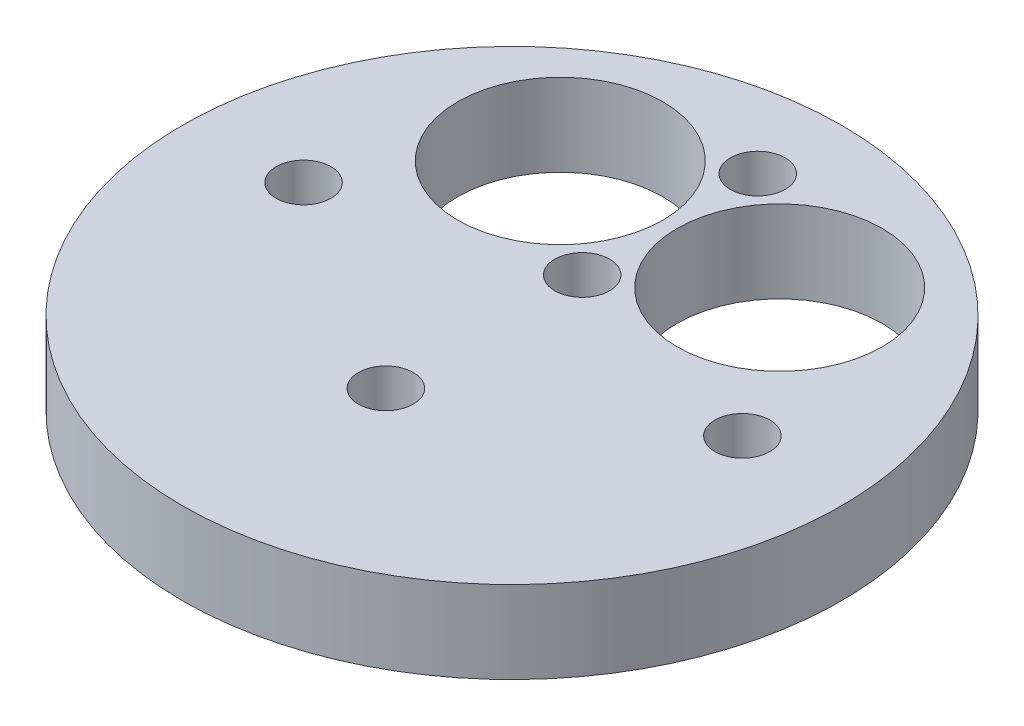
ISO-10303-21;
HEADER;
FILE_DESCRIPTION(('STEP AP214'),'2;1');
FILE_NAME('part.step','',(''),(''),'','','');
FILE_SCHEMA(('AUTOMOTIVE_DESIGN { 1 0 10303 214 1 1 1 1 }'));
ENDSEC;
DATA;
#1=APPLICATION_CONTEXT('core data for automotive mechanical design processes');
#2=APPLICATION_PROTOCOL_DEFINITION('international standard','automotive_design',2000,#1);
#3=PRODUCT_CONTEXT('',#1,'mechanical');
#4=PRODUCT('Part','Part','',(#3));
#5=PRODUCT_RELATED_PRODUCT_CATEGORY('part','',(#4));
#6=PRODUCT_DEFINITION_FORMATION('','',#4);
#7=PRODUCT_DEFINITION_CONTEXT('part definition',#1,'design');
#8=PRODUCT_DEFINITION('design','',#6,#7);
#9=PRODUCT_DEFINITION_SHAPE('','',#8);
#10=(LENGTH_UNIT() NAMED_UNIT(*) SI_UNIT(.MILLI.,.METRE.));
#11=(NAMED_UNIT(*) PLANE_ANGLE_UNIT() SI_UNIT($,.RADIAN.));
#12=(NAMED_UNIT(*) SI_UNIT($,.STERADIAN.) SOLID_ANGLE_UNIT());
#13=UNCERTAINTY_MEASURE_WITH_UNIT(LENGTH_MEASURE(1.E-05),#10,'distance_accuracy_value','');
#14=(GEOMETRIC_REPRESENTATION_CONTEXT(3) GLOBAL_UNCERTAINTY_ASSIGNED_CONTEXT((#13)) GLOBAL_UNIT_ASSIGNED_CONTEXT((#10,
#11,#12)) REPRESENTATION_CONTEXT('',''));
#15=CARTESIAN_POINT('',(0.,0.,0.));
#16=DIRECTION('',(0.,0.,1.));
#17=DIRECTION('',(1.,0.,0.));
#18=AXIS2_PLACEMENT_3D('',#15,#16,#17);
#19=CARTESIAN_POINT('',(0.,0.,0.));
#20=DIRECTION('',(0.,-1.,0.));
#21=DIRECTION('',(0.,0.,-1.));
#22=AXIS2_PLACEMENT_3D('',#19,#20,#21);
#23=PLANE('',#22);
#24=CARTESIAN_POINT('',(-25.4,0.,-1.27));
#25=DIRECTION('',(0.,1.,0.));
#26=DIRECTION('',(0.,0.,1.));
#27=AXIS2_PLACEMENT_3D('',#24,#25,#26);
#28=CIRCLE('',#27,3.175);
#29=CARTESIAN_POINT('',(-25.4,0.,1.905));
#30=VERTEX_POINT('',#29);
#31=EDGE_CURVE('E121',#30,#30,#28,.T.);
#32=ORIENTED_EDGE('',*,*,#31,.T.);
#33=EDGE_LOOP('',(#32));
#34=FACE_BOUND('',#33,.T.);
#35=CARTESIAN_POINT('',(25.4,0.,-1.27000000000001));
#36=DIRECTION('',(0.,1.,0.));
#37=DIRECTION('',(0.,0.,1.));
#38=AXIS2_PLACEMENT_3D('',#35,#36,#37);
#39=CIRCLE('',#38,3.175);
#40=CARTESIAN_POINT('',(25.4,0.,1.90499999999999));
#41=VERTEX_POINT('',#40);
#42=EDGE_CURVE('E125',#41,#41,#39,.T.);
#43=ORIENTED_EDGE('',*,*,#42,.T.);
#44=EDGE_LOOP('',(#43));
#45=FACE_BOUND('',#44,.T.);
#46=CARTESIAN_POINT('',(0.,0.,-28.448));
#47=DIRECTION('',(0.,1.,0.));
#48=DIRECTION('',(0.,0.,1.));
#49=AXIS2_PLACEMENT_3D('',#46,#47,#48);
#50=CIRCLE('',#49,3.175);
#51=CARTESIAN_POINT('',(0.,0.,-25.273));
#52=VERTEX_POINT('',#51);
#53=EDGE_CURVE('E138',#52,#52,#50,.T.);
#54=ORIENTED_EDGE('',*,*,#53,.T.);
#55=EDGE_LOOP('',(#54));
#56=FACE_BOUND('',#55,.T.);
#57=CARTESIAN_POINT('',(12.7,0.,-18.288));
#58=DIRECTION('',(0.,1.,0.));
#59=DIRECTION('',(0.,0.,1.));
#60=AXIS2_PLACEMENT_3D('',#57,#58,#59);
#61=CIRCLE('',#60,11.8745);
#62=CARTESIAN_POINT('',(12.7,0.,-6.4135));
#63=VERTEX_POINT('',#62);
#64=EDGE_CURVE('E143',#63,#63,#61,.T.);
#65=ORIENTED_EDGE('',*,*,#64,.T.);
#66=EDGE_LOOP('',(#65));
#67=FACE_BOUND('',#66,.T.);
#68=CARTESIAN_POINT('',(0.,0.,-8.128));
#69=DIRECTION('',(0.,1.,0.));
#70=DIRECTION('',(0.,0.,1.));
#71=AXIS2_PLACEMENT_3D('',#68,#69,#70);
#72=CIRCLE('',#71,3.175);
#73=CARTESIAN_POINT('',(0.,0.,-4.953));
#74=VERTEX_POINT('',#73);
#75=EDGE_CURVE('E135',#74,#74,#72,.T.);
#76=ORIENTED_EDGE('',*,*,#75,.T.);
#77=EDGE_LOOP('',(#76));
#78=FACE_BOUND('',#77,.T.);
#79=CARTESIAN_POINT('',(0.,0.,14.605));
#80=DIRECTION('',(0.,1.,0.));
#81=DIRECTION('',(0.,0.,1.));
#82=AXIS2_PLACEMENT_3D('',#79,#80,#81);
#83=CIRCLE('',#82,3.175);
#84=CARTESIAN_POINT('',(0.,0.,17.78));
#85=VERTEX_POINT('',#84);
#86=EDGE_CURVE('E127',#85,#85,#83,.T.);
#87=ORIENTED_EDGE('',*,*,#86,.T.);
#88=EDGE_LOOP('',(#87));
#89=FACE_BOUND('',#88,.T.);
#90=CARTESIAN_POINT('',(-12.7,0.,-18.288));
#91=DIRECTION('',(0.,1.,0.));
#92=DIRECTION('',(0.,0.,1.));
#93=AXIS2_PLACEMENT_3D('',#90,#91,#92);
#94=CIRCLE('',#93,11.8745);
#95=CARTESIAN_POINT('',(-12.7,0.,-6.4135));
#96=VERTEX_POINT('',#95);
#97=EDGE_CURVE('E55',#96,#96,#94,.T.);
#98=ORIENTED_EDGE('',*,*,#97,.T.);
#99=EDGE_LOOP('',(#98));
#100=FACE_BOUND('',#99,.T.);
#101=CARTESIAN_POINT('',(0.,0.,0.));
#102=DIRECTION('',(0.,-1.,0.));
#103=DIRECTION('',(0.,0.,-1.));
#104=AXIS2_PLACEMENT_3D('',#101,#102,#103);
#105=CIRCLE('',#104,38.1508);
#106=CARTESIAN_POINT('',(0.,0.,-38.1508));
#107=VERTEX_POINT('',#106);
#108=EDGE_CURVE('E10',#107,#107,#105,.T.);
#109=ORIENTED_EDGE('',*,*,#108,.T.);
#110=EDGE_LOOP('',(#109));
#111=FACE_BOUND('',#110,.T.);
#112=ADVANCED_FACE('F36',(#34,#45,#56,#67,#78,#89,#100,#111),#23,.T.);
#113=CARTESIAN_POINT('',(0.,0.,0.));
#114=DIRECTION('',(0.,-1.,0.));
#115=DIRECTION('',(0.,0.,-1.));
#116=AXIS2_PLACEMENT_3D('',#113,#114,#115);
#117=CYLINDRICAL_SURFACE('',#116,38.1508);
#118=CARTESIAN_POINT('',(0.,9.525,0.));
#119=DIRECTION('',(0.,-1.,0.));
#120=DIRECTION('',(0.,0.,-1.));
#121=AXIS2_PLACEMENT_3D('',#118,#119,#120);
#122=CIRCLE('',#121,38.1508);
#123=CARTESIAN_POINT('',(0.,9.525,-38.1508));
#124=VERTEX_POINT('',#123);
#125=EDGE_CURVE('E43',#124,#124,#122,.T.);
#126=ORIENTED_EDGE('',*,*,#125,.T.);
#127=EDGE_LOOP('',(#126));
#128=FACE_BOUND('',#127,.T.);
#129=ORIENTED_EDGE('',*,*,#108,.F.);
#130=EDGE_LOOP('',(#129));
#131=FACE_BOUND('',#130,.T.);
#132=ADVANCED_FACE('F74',(#128,#131),#117,.T.);
#133=CARTESIAN_POINT('',(38.1508,9.525,0.));
#134=DIRECTION('',(0.,1.,0.));
#135=DIRECTION('',(0.,0.,1.));
#136=AXIS2_PLACEMENT_3D('',#133,#134,#135);
#137=PLANE('',#136);
#138=CARTESIAN_POINT('',(-25.4,9.525,-1.27));
#139=DIRECTION('',(0.,1.,0.));
#140=DIRECTION('',(0.,0.,1.));
#141=AXIS2_PLACEMENT_3D('',#138,#139,#140);
#142=CIRCLE('',#141,3.175);
#143=CARTESIAN_POINT('',(-25.4,9.52499999999999,1.905));
#144=VERTEX_POINT('',#143);
#145=EDGE_CURVE('E124',#144,#144,#142,.T.);
#146=ORIENTED_EDGE('',*,*,#145,.F.);
#147=EDGE_LOOP('',(#146));
#148=FACE_BOUND('',#147,.T.);
#149=CARTESIAN_POINT('',(25.4,9.525,-1.27000000000001));
#150=DIRECTION('',(0.,1.,0.));
#151=DIRECTION('',(0.,0.,1.));
#152=AXIS2_PLACEMENT_3D('',#149,#150,#151);
#153=CIRCLE('',#152,3.175);
#154=CARTESIAN_POINT('',(25.4,9.52499999999999,1.90499999999999));
#155=VERTEX_POINT('',#154);
#156=EDGE_CURVE('E130',#155,#155,#153,.T.);
#157=ORIENTED_EDGE('',*,*,#156,.F.);
#158=EDGE_LOOP('',(#157));
#159=FACE_BOUND('',#158,.T.);
#160=CARTESIAN_POINT('',(0.,9.525,-28.448));
#161=DIRECTION('',(0.,1.,0.));
#162=DIRECTION('',(0.,0.,1.));
#163=AXIS2_PLACEMENT_3D('',#160,#161,#162);
#164=CIRCLE('',#163,3.175);
#165=CARTESIAN_POINT('',(0.,9.52499999999999,-25.273));
#166=VERTEX_POINT('',#165);
#167=EDGE_CURVE('E39',#166,#166,#164,.T.);
#168=ORIENTED_EDGE('',*,*,#167,.F.);
#169=EDGE_LOOP('',(#168));
#170=FACE_BOUND('',#169,.T.);
#171=CARTESIAN_POINT('',(12.7,9.525,-18.288));
#172=DIRECTION('',(0.,1.,0.));
#173=DIRECTION('',(0.,0.,1.));
#174=AXIS2_PLACEMENT_3D('',#171,#172,#173);
#175=CIRCLE('',#174,11.8745);
#176=CARTESIAN_POINT('',(12.7,9.52499999999999,-6.4135));
#177=VERTEX_POINT('',#176);
#178=EDGE_CURVE('E60',#177,#177,#175,.T.);
#179=ORIENTED_EDGE('',*,*,#178,.F.);
#180=EDGE_LOOP('',(#179));
#181=FACE_BOUND('',#180,.T.);
#182=CARTESIAN_POINT('',(0.,9.525,-8.128));
#183=DIRECTION('',(0.,1.,0.));
#184=DIRECTION('',(0.,0.,1.));
#185=AXIS2_PLACEMENT_3D('',#182,#183,#184);
#186=CIRCLE('',#185,3.175);
#187=CARTESIAN_POINT('',(0.,9.52499999999999,-4.953));
#188=VERTEX_POINT('',#187);
#189=EDGE_CURVE('E58',#188,#188,#186,.T.);
#190=ORIENTED_EDGE('',*,*,#189,.F.);
#191=EDGE_LOOP('',(#190));
#192=FACE_BOUND('',#191,.T.);
#193=CARTESIAN_POINT('',(0.,9.525,14.605));
#194=DIRECTION('',(0.,1.,0.));
#195=DIRECTION('',(0.,0.,1.));
#196=AXIS2_PLACEMENT_3D('',#193,#194,#195);
#197=CIRCLE('',#196,3.175);
#198=CARTESIAN_POINT('',(0.,9.52499999999999,17.78));
#199=VERTEX_POINT('',#198);
#200=EDGE_CURVE('E54',#199,#199,#197,.T.);
#201=ORIENTED_EDGE('',*,*,#200,.F.);
#202=EDGE_LOOP('',(#201));
#203=FACE_BOUND('',#202,.T.);
#204=CARTESIAN_POINT('',(-12.7,9.525,-18.288));
#205=DIRECTION('',(0.,1.,0.));
#206=DIRECTION('',(0.,0.,1.));
#207=AXIS2_PLACEMENT_3D('',#204,#205,#206);
#208=CIRCLE('',#207,11.8745);
#209=CARTESIAN_POINT('',(-12.7,9.52499999999999,-6.4135));
#210=VERTEX_POINT('',#209);
#211=EDGE_CURVE('E51',#210,#210,#208,.T.);
#212=ORIENTED_EDGE('',*,*,#211,.F.);
#213=EDGE_LOOP('',(#212));
#214=FACE_BOUND('',#213,.T.);
#215=ORIENTED_EDGE('',*,*,#125,.F.);
#216=EDGE_LOOP('',(#215));
#217=FACE_BOUND('',#216,.T.);
#218=ADVANCED_FACE('F70',(#148,#159,#170,#181,#192,#203,#214,#217),#137,.T.);
#219=CARTESIAN_POINT('',(-12.7,0.,-18.288));
#220=DIRECTION('',(0.,1.,0.));
#221=DIRECTION('',(0.,0.,1.));
#222=AXIS2_PLACEMENT_3D('',#219,#220,#221);
#223=CYLINDRICAL_SURFACE('',#222,11.8745);
#224=CARTESIAN_POINT('',(-12.7,9.52499999999999,-6.4135));
#225=CARTESIAN_POINT('',(-12.7,9.42578124999999,-6.4135));
#226=CARTESIAN_POINT('',(-12.7,9.32656249999999,-6.4135));
#227=CARTESIAN_POINT('',(-12.7,9.12812499999999,-6.4135));
#228=CARTESIAN_POINT('',(-12.7,9.02890624999999,-6.4135));
#229=CARTESIAN_POINT('',(-12.7,8.83046874999999,-6.4135));
#230=CARTESIAN_POINT('',(-12.7,8.73124999999999,-6.4135));
#231=CARTESIAN_POINT('',(-12.7,8.5328125,-6.4135));
#232=CARTESIAN_POINT('',(-12.7,8.43359374999999,-6.4135));
#233=CARTESIAN_POINT('',(-12.7,8.23515625,-6.4135));
#234=CARTESIAN_POINT('',(-12.7,8.13593749999999,-6.4135));
#235=CARTESIAN_POINT('',(-12.7,7.93749999999999,-6.4135));
#236=CARTESIAN_POINT('',(-12.7,7.83828125,-6.4135));
#237=CARTESIAN_POINT('',(-12.7,7.63984374999999,-6.4135));
#238=CARTESIAN_POINT('',(-12.7,7.540625,-6.4135));
#239=CARTESIAN_POINT('',(-12.7,7.3421875,-6.4135));
#240=CARTESIAN_POINT('',(-12.7,7.24296874999999,-6.4135));
#241=CARTESIAN_POINT('',(-12.7,7.04453125,-6.4135));
#242=CARTESIAN_POINT('',(-12.7,6.9453125,-6.4135));
#243=CARTESIAN_POINT('',(-12.7,6.746875,-6.4135));
#244=CARTESIAN_POINT('',(-12.7,6.64765625,-6.4135));
#245=CARTESIAN_POINT('',(-12.7,6.44921875,-6.4135));
#246=CARTESIAN_POINT('',(-12.7,6.35,-6.4135));
#247=CARTESIAN_POINT('',(-12.7,6.1515625,-6.4135));
#248=CARTESIAN_POINT('',(-12.7,6.05234375,-6.4135));
#249=CARTESIAN_POINT('',(-12.7,5.85390625,-6.4135));
#250=CARTESIAN_POINT('',(-12.7,5.7546875,-6.4135));
#251=CARTESIAN_POINT('',(-12.7,5.55625,-6.4135));
#252=CARTESIAN_POINT('',(-12.7,5.45703125,-6.4135));
#253=CARTESIAN_POINT('',(-12.7,5.25859375,-6.4135));
#254=CARTESIAN_POINT('',(-12.7,5.159375,-6.4135));
#255=CARTESIAN_POINT('',(-12.7,4.9609375,-6.4135));
#256=CARTESIAN_POINT('',(-12.7,4.86171875,-6.4135));
#257=CARTESIAN_POINT('',(-12.7,4.66328125,-6.4135));
#258=CARTESIAN_POINT('',(-12.7,4.5640625,-6.4135));
#259=CARTESIAN_POINT('',(-12.7,4.365625,-6.4135));
#260=CARTESIAN_POINT('',(-12.7,4.26640625,-6.4135));
#261=CARTESIAN_POINT('',(-12.7,4.06796875,-6.4135));
#262=CARTESIAN_POINT('',(-12.7,3.96875,-6.4135));
#263=CARTESIAN_POINT('',(-12.7,3.7703125,-6.4135));
#264=CARTESIAN_POINT('',(-12.7,3.67109375,-6.4135));
#265=CARTESIAN_POINT('',(-12.7,3.47265625,-6.4135));
#266=CARTESIAN_POINT('',(-12.7,3.3734375,-6.4135));
#267=CARTESIAN_POINT('',(-12.7,3.175,-6.4135));
#268=CARTESIAN_POINT('',(-12.7,3.07578125,-6.4135));
#269=CARTESIAN_POINT('',(-12.7,2.87734375,-6.4135));
#270=CARTESIAN_POINT('',(-12.7,2.778125,-6.4135));
#271=CARTESIAN_POINT('',(-12.7,2.5796875,-6.4135));
#272=CARTESIAN_POINT('',(-12.7,2.48046875,-6.4135));
#273=CARTESIAN_POINT('',(-12.7,2.28203125,-6.4135));
#274=CARTESIAN_POINT('',(-12.7,2.1828125,-6.4135));
#275=CARTESIAN_POINT('',(-12.7,1.984375,-6.4135));
#276=CARTESIAN_POINT('',(-12.7,1.88515625,-6.4135));
#277=CARTESIAN_POINT('',(-12.7,1.68671875,-6.4135));
#278=CARTESIAN_POINT('',(-12.7,1.5875,-6.4135));
#279=CARTESIAN_POINT('',(-12.7,1.3890625,-6.4135));
#280=CARTESIAN_POINT('',(-12.7,1.28984375,-6.4135));
#281=CARTESIAN_POINT('',(-12.7,1.09140625,-6.4135));
#282=CARTESIAN_POINT('',(-12.7,0.992187499999999,-6.4135));
#283=CARTESIAN_POINT('',(-12.7,0.793749999999999,-6.4135));
#284=CARTESIAN_POINT('',(-12.7,0.69453125,-6.4135));
#285=CARTESIAN_POINT('',(-12.7,0.49609375,-6.4135));
#286=CARTESIAN_POINT('',(-12.7,0.396875,-6.4135));
#287=CARTESIAN_POINT('',(-12.7,0.1984375,-6.4135));
#288=CARTESIAN_POINT('',(-12.7,0.09921875,-6.4135));
#289=CARTESIAN_POINT('',(-12.7,0.,-6.4135));
#290=B_SPLINE_CURVE_WITH_KNOTS('',3,(#224,#225,#226,#227,#228,#229,#230,#231,#232,#233,#234,
#235,#236,#237,#238,#239,#240,#241,#242,#243,#244,#245,#246,#247,#248,#249,#250,#251,#252,#253,
#254,#255,#256,#257,#258,#259,#260,#261,#262,#263,#264,#265,#266,#267,#268,#269,#270,#271,#272,
#273,#274,#275,#276,#277,#278,#279,#280,#281,#282,#283,#284,#285,#286,#287,#288,#289),
.UNSPECIFIED.,.F.,.F.,(4,2,2,2,2,2,2,2,2,2,2,2,2,2,2,2,2,2,2,2,2,2,2,2,2,2,2,2,2,2,2,2,4),(0.,
0.29765625,0.5953125,0.892968749999999,1.190625,1.48828125,1.7859375,2.08359375,2.38125,
2.67890625,2.9765625,3.27421875,3.571875,3.86953125,4.1671875,4.46484375,4.7625,5.06015625,
5.3578125,5.65546875,5.953125,6.25078125,6.5484375,6.84609375,7.14375,7.44140625,
7.73906249999999,8.03671875,8.33437499999999,8.63203125,8.92968749999999,9.22734374999999,
9.52499999999999),.UNSPECIFIED.);
#291=EDGE_CURVE('BSEAM73',#210,#96,#290,.T.);
#292=ORIENTED_EDGE('',*,*,#211,.T.);
#293=ORIENTED_EDGE('',*,*,#97,.F.);
#294=ORIENTED_EDGE('',*,*,#291,.T.);
#295=ORIENTED_EDGE('',*,*,#291,.F.);
#296=EDGE_LOOP('',(#292,#294,#293,#295));
#297=FACE_BOUND('',#296,.T.);
#298=ADVANCED_FACE('F73',(#297),#223,.F.);
#299=CARTESIAN_POINT('',(0.,0.,14.605));
#300=DIRECTION('',(0.,1.,0.));
#301=DIRECTION('',(0.,0.,1.));
#302=AXIS2_PLACEMENT_3D('',#299,#300,#301);
#303=CYLINDRICAL_SURFACE('',#302,3.175);
#304=CARTESIAN_POINT('',(0.,9.52499999999999,17.78));
#305=CARTESIAN_POINT('',(0.,9.42578124999999,17.78));
#306=CARTESIAN_POINT('',(0.,9.32656249999999,17.78));
#307=CARTESIAN_POINT('',(0.,9.12812499999999,17.78));
#308=CARTESIAN_POINT('',(0.,9.02890624999999,17.78));
#309=CARTESIAN_POINT('',(0.,8.83046874999999,17.78));
#310=CARTESIAN_POINT('',(0.,8.73124999999999,17.78));
#311=CARTESIAN_POINT('',(0.,8.5328125,17.78));
#312=CARTESIAN_POINT('',(0.,8.43359374999999,17.78));
#313=CARTESIAN_POINT('',(0.,8.23515625,17.78));
#314=CARTESIAN_POINT('',(0.,8.13593749999999,17.78));
#315=CARTESIAN_POINT('',(0.,7.93749999999999,17.78));
#316=CARTESIAN_POINT('',(0.,7.83828125,17.78));
#317=CARTESIAN_POINT('',(0.,7.63984374999999,17.78));
#318=CARTESIAN_POINT('',(0.,7.540625,17.78));
#319=CARTESIAN_POINT('',(0.,7.3421875,17.78));
#320=CARTESIAN_POINT('',(0.,7.24296874999999,17.78));
#321=CARTESIAN_POINT('',(0.,7.04453125,17.78));
#322=CARTESIAN_POINT('',(0.,6.9453125,17.78));
#323=CARTESIAN_POINT('',(0.,6.746875,17.78));
#324=CARTESIAN_POINT('',(0.,6.64765625,17.78));
#325=CARTESIAN_POINT('',(0.,6.44921875,17.78));
#326=CARTESIAN_POINT('',(0.,6.35,17.78));
#327=CARTESIAN_POINT('',(0.,6.1515625,17.78));
#328=CARTESIAN_POINT('',(0.,6.05234375,17.78));
#329=CARTESIAN_POINT('',(0.,5.85390625,17.78));
#330=CARTESIAN_POINT('',(0.,5.7546875,17.78));
#331=CARTESIAN_POINT('',(0.,5.55625,17.78));
#332=CARTESIAN_POINT('',(0.,5.45703125,17.78));
#333=CARTESIAN_POINT('',(0.,5.25859375,17.78));
#334=CARTESIAN_POINT('',(0.,5.159375,17.78));
#335=CARTESIAN_POINT('',(0.,4.9609375,17.78));
#336=CARTESIAN_POINT('',(0.,4.86171875,17.78));
#337=CARTESIAN_POINT('',(0.,4.66328125,17.78));
#338=CARTESIAN_POINT('',(0.,4.5640625,17.78));
#339=CARTESIAN_POINT('',(0.,4.365625,17.78));
#340=CARTESIAN_POINT('',(0.,4.26640625,17.78));
#341=CARTESIAN_POINT('',(0.,4.06796875,17.78));
#342=CARTESIAN_POINT('',(0.,3.96875,17.78));
#343=CARTESIAN_POINT('',(0.,3.7703125,17.78));
#344=CARTESIAN_POINT('',(0.,3.67109375,17.78));
#345=CARTESIAN_POINT('',(0.,3.47265625,17.78));
#346=CARTESIAN_POINT('',(0.,3.3734375,17.78));
#347=CARTESIAN_POINT('',(0.,3.175,17.78));
#348=CARTESIAN_POINT('',(0.,3.07578125,17.78));
#349=CARTESIAN_POINT('',(0.,2.87734375,17.78));
#350=CARTESIAN_POINT('',(0.,2.778125,17.78));
#351=CARTESIAN_POINT('',(0.,2.5796875,17.78));
#352=CARTESIAN_POINT('',(0.,2.48046875,17.78));
#353=CARTESIAN_POINT('',(0.,2.28203125,17.78));
#354=CARTESIAN_POINT('',(0.,2.1828125,17.78));
#355=CARTESIAN_POINT('',(0.,1.984375,17.78));
#356=CARTESIAN_POINT('',(0.,1.88515625,17.78));
#357=CARTESIAN_POINT('',(0.,1.68671875,17.78));
#358=CARTESIAN_POINT('',(0.,1.5875,17.78));
#359=CARTESIAN_POINT('',(0.,1.3890625,17.78));
#360=CARTESIAN_POINT('',(0.,1.28984375,17.78));
#361=CARTESIAN_POINT('',(0.,1.09140625,17.78));
#362=CARTESIAN_POINT('',(0.,0.992187499999999,17.78));
#363=CARTESIAN_POINT('',(0.,0.793749999999999,17.78));
#364=CARTESIAN_POINT('',(0.,0.69453125,17.78));
#365=CARTESIAN_POINT('',(0.,0.49609375,17.78));
#366=CARTESIAN_POINT('',(0.,0.396875,17.78));
#367=CARTESIAN_POINT('',(0.,0.1984375,17.78));
#368=CARTESIAN_POINT('',(0.,0.09921875,17.78));
#369=CARTESIAN_POINT('',(0.,0.,17.78));
#370=B_SPLINE_CURVE_WITH_KNOTS('',3,(#304,#305,#306,#307,#308,#309,#310,#311,#312,#313,#314,
#315,#316,#317,#318,#319,#320,#321,#322,#323,#324,#325,#326,#327,#328,#329,#330,#331,#332,#333,
#334,#335,#336,#337,#338,#339,#340,#341,#342,#343,#344,#345,#346,#347,#348,#349,#350,#351,#352,
#353,#354,#355,#356,#357,#358,#359,#360,#361,#362,#363,#364,#365,#366,#367,#368,#369),
.UNSPECIFIED.,.F.,.F.,(4,2,2,2,2,2,2,2,2,2,2,2,2,2,2,2,2,2,2,2,2,2,2,2,2,2,2,2,2,2,2,2,4),(0.,
0.29765625,0.5953125,0.892968749999999,1.190625,1.48828125,1.7859375,2.08359375,2.38125,
2.67890625,2.9765625,3.27421875,3.571875,3.86953125,4.1671875,4.46484375,4.7625,5.06015625,
5.3578125,5.65546875,5.953125,6.25078125,6.5484375,6.84609375,7.14375,7.44140625,
7.73906249999999,8.03671875,8.33437499999999,8.63203125,8.92968749999999,9.22734374999999,
9.52499999999999),.UNSPECIFIED.);
#371=EDGE_CURVE('BSEAM95',#199,#85,#370,.T.);
#372=ORIENTED_EDGE('',*,*,#200,.T.);
#373=ORIENTED_EDGE('',*,*,#86,.F.);
#374=ORIENTED_EDGE('',*,*,#371,.T.);
#375=ORIENTED_EDGE('',*,*,#371,.F.);
#376=EDGE_LOOP('',(#372,#374,#373,#375));
#377=FACE_BOUND('',#376,.T.);
#378=ADVANCED_FACE('F95',(#377),#303,.F.);
#379=CARTESIAN_POINT('',(0.,0.,-8.128));
#380=DIRECTION('',(0.,1.,0.));
#381=DIRECTION('',(0.,0.,1.));
#382=AXIS2_PLACEMENT_3D('',#379,#380,#381);
#383=CYLINDRICAL_SURFACE('',#382,3.175);
#384=CARTESIAN_POINT('',(0.,9.52499999999999,-4.953));
#385=CARTESIAN_POINT('',(0.,9.42578124999999,-4.953));
#386=CARTESIAN_POINT('',(0.,9.32656249999999,-4.953));
#387=CARTESIAN_POINT('',(0.,9.12812499999999,-4.953));
#388=CARTESIAN_POINT('',(0.,9.02890624999999,-4.953));
#389=CARTESIAN_POINT('',(0.,8.83046874999999,-4.953));
#390=CARTESIAN_POINT('',(0.,8.73124999999999,-4.953));
#391=CARTESIAN_POINT('',(0.,8.5328125,-4.953));
#392=CARTESIAN_POINT('',(0.,8.43359374999999,-4.953));
#393=CARTESIAN_POINT('',(0.,8.23515625,-4.953));
#394=CARTESIAN_POINT('',(0.,8.13593749999999,-4.953));
#395=CARTESIAN_POINT('',(0.,7.93749999999999,-4.953));
#396=CARTESIAN_POINT('',(0.,7.83828125,-4.953));
#397=CARTESIAN_POINT('',(0.,7.63984374999999,-4.953));
#398=CARTESIAN_POINT('',(0.,7.540625,-4.953));
#399=CARTESIAN_POINT('',(0.,7.3421875,-4.953));
#400=CARTESIAN_POINT('',(0.,7.24296874999999,-4.953));
#401=CARTESIAN_POINT('',(0.,7.04453125,-4.953));
#402=CARTESIAN_POINT('',(0.,6.9453125,-4.953));
#403=CARTESIAN_POINT('',(0.,6.746875,-4.953));
#404=CARTESIAN_POINT('',(0.,6.64765625,-4.953));
#405=CARTESIAN_POINT('',(0.,6.44921875,-4.953));
#406=CARTESIAN_POINT('',(0.,6.35,-4.953));
#407=CARTESIAN_POINT('',(0.,6.1515625,-4.953));
#408=CARTESIAN_POINT('',(0.,6.05234375,-4.953));
#409=CARTESIAN_POINT('',(0.,5.85390625,-4.953));
#410=CARTESIAN_POINT('',(0.,5.7546875,-4.953));
#411=CARTESIAN_POINT('',(0.,5.55625,-4.953));
#412=CARTESIAN_POINT('',(0.,5.45703125,-4.953));
#413=CARTESIAN_POINT('',(0.,5.25859375,-4.953));
#414=CARTESIAN_POINT('',(0.,5.159375,-4.953));
#415=CARTESIAN_POINT('',(0.,4.9609375,-4.953));
#416=CARTESIAN_POINT('',(0.,4.86171875,-4.953));
#417=CARTESIAN_POINT('',(0.,4.66328125,-4.953));
#418=CARTESIAN_POINT('',(0.,4.5640625,-4.953));
#419=CARTESIAN_POINT('',(0.,4.365625,-4.953));
#420=CARTESIAN_POINT('',(0.,4.26640625,-4.953));
#421=CARTESIAN_POINT('',(0.,4.06796875,-4.953));
#422=CARTESIAN_POINT('',(0.,3.96875,-4.953));
#423=CARTESIAN_POINT('',(0.,3.7703125,-4.953));
#424=CARTESIAN_POINT('',(0.,3.67109375,-4.953));
#425=CARTESIAN_POINT('',(0.,3.47265625,-4.953));
#426=CARTESIAN_POINT('',(0.,3.3734375,-4.953));
#427=CARTESIAN_POINT('',(0.,3.175,-4.953));
#428=CARTESIAN_POINT('',(0.,3.07578125,-4.953));
#429=CARTESIAN_POINT('',(0.,2.87734375,-4.953));
#430=CARTESIAN_POINT('',(0.,2.778125,-4.953));
#431=CARTESIAN_POINT('',(0.,2.5796875,-4.953));
#432=CARTESIAN_POINT('',(0.,2.48046875,-4.953));
#433=CARTESIAN_POINT('',(0.,2.28203125,-4.953));
#434=CARTESIAN_POINT('',(0.,2.1828125,-4.953));
#435=CARTESIAN_POINT('',(0.,1.984375,-4.953));
#436=CARTESIAN_POINT('',(0.,1.88515625,-4.953));
#437=CARTESIAN_POINT('',(0.,1.68671875,-4.953));
#438=CARTESIAN_POINT('',(0.,1.5875,-4.953));
#439=CARTESIAN_POINT('',(0.,1.3890625,-4.953));
#440=CARTESIAN_POINT('',(0.,1.28984375,-4.953));
#441=CARTESIAN_POINT('',(0.,1.09140625,-4.953));
#442=CARTESIAN_POINT('',(0.,0.992187499999999,-4.953));
#443=CARTESIAN_POINT('',(0.,0.793749999999999,-4.953));
#444=CARTESIAN_POINT('',(0.,0.69453125,-4.953));
#445=CARTESIAN_POINT('',(0.,0.49609375,-4.953));
#446=CARTESIAN_POINT('',(0.,0.396875,-4.953));
#447=CARTESIAN_POINT('',(0.,0.1984375,-4.953));
#448=CARTESIAN_POINT('',(0.,0.09921875,-4.953));
#449=CARTESIAN_POINT('',(0.,0.,-4.953));
#450=B_SPLINE_CURVE_WITH_KNOTS('',3,(#384,#385,#386,#387,#388,#389,#390,#391,#392,#393,#394,
#395,#396,#397,#398,#399,#400,#401,#402,#403,#404,#405,#406,#407,#408,#409,#410,#411,#412,#413,
#414,#415,#416,#417,#418,#419,#420,#421,#422,#423,#424,#425,#426,#427,#428,#429,#430,#431,#432,
#433,#434,#435,#436,#437,#438,#439,#440,#441,#442,#443,#444,#445,#446,#447,#448,#449),
.UNSPECIFIED.,.F.,.F.,(4,2,2,2,2,2,2,2,2,2,2,2,2,2,2,2,2,2,2,2,2,2,2,2,2,2,2,2,2,2,2,2,4),(0.,
0.29765625,0.5953125,0.892968749999999,1.190625,1.48828125,1.7859375,2.08359375,2.38125,
2.67890625,2.9765625,3.27421875,3.571875,3.86953125,4.1671875,4.46484375,4.7625,5.06015625,
5.3578125,5.65546875,5.953125,6.25078125,6.5484375,6.84609375,7.14375,7.44140625,
7.73906249999999,8.03671875,8.33437499999999,8.63203125,8.92968749999999,9.22734374999999,
9.52499999999999),.UNSPECIFIED.);
#451=EDGE_CURVE('BSEAM100',#188,#74,#450,.T.);
#452=ORIENTED_EDGE('',*,*,#189,.T.);
#453=ORIENTED_EDGE('',*,*,#75,.F.);
#454=ORIENTED_EDGE('',*,*,#451,.T.);
#455=ORIENTED_EDGE('',*,*,#451,.F.);
#456=EDGE_LOOP('',(#452,#454,#453,#455));
#457=FACE_BOUND('',#456,.T.);
#458=ADVANCED_FACE('F100',(#457),#383,.F.);
#459=CARTESIAN_POINT('',(12.7,0.,-18.288));
#460=DIRECTION('',(0.,1.,0.));
#461=DIRECTION('',(0.,0.,1.));
#462=AXIS2_PLACEMENT_3D('',#459,#460,#461);
#463=CYLINDRICAL_SURFACE('',#462,11.8745);
#464=CARTESIAN_POINT('',(12.7,9.52499999999999,-6.4135));
#465=CARTESIAN_POINT('',(12.7,9.42578124999999,-6.4135));
#466=CARTESIAN_POINT('',(12.7,9.32656249999999,-6.4135));
#467=CARTESIAN_POINT('',(12.7,9.12812499999999,-6.4135));
#468=CARTESIAN_POINT('',(12.7,9.02890624999999,-6.4135));
#469=CARTESIAN_POINT('',(12.7,8.83046874999999,-6.4135));
#470=CARTESIAN_POINT('',(12.7,8.73124999999999,-6.4135));
#471=CARTESIAN_POINT('',(12.7,8.5328125,-6.4135));
#472=CARTESIAN_POINT('',(12.7,8.43359374999999,-6.4135));
#473=CARTESIAN_POINT('',(12.7,8.23515625,-6.4135));
#474=CARTESIAN_POINT('',(12.7,8.13593749999999,-6.4135));
#475=CARTESIAN_POINT('',(12.7,7.93749999999999,-6.4135));
#476=CARTESIAN_POINT('',(12.7,7.83828125,-6.4135));
#477=CARTESIAN_POINT('',(12.7,7.63984374999999,-6.4135));
#478=CARTESIAN_POINT('',(12.7,7.540625,-6.4135));
#479=CARTESIAN_POINT('',(12.7,7.3421875,-6.4135));
#480=CARTESIAN_POINT('',(12.7,7.24296874999999,-6.4135));
#481=CARTESIAN_POINT('',(12.7,7.04453125,-6.4135));
#482=CARTESIAN_POINT('',(12.7,6.9453125,-6.4135));
#483=CARTESIAN_POINT('',(12.7,6.746875,-6.4135));
#484=CARTESIAN_POINT('',(12.7,6.64765625,-6.4135));
#485=CARTESIAN_POINT('',(12.7,6.44921875,-6.4135));
#486=CARTESIAN_POINT('',(12.7,6.35,-6.4135));
#487=CARTESIAN_POINT('',(12.7,6.1515625,-6.4135));
#488=CARTESIAN_POINT('',(12.7,6.05234375,-6.4135));
#489=CARTESIAN_POINT('',(12.7,5.85390625,-6.4135));
#490=CARTESIAN_POINT('',(12.7,5.7546875,-6.4135));
#491=CARTESIAN_POINT('',(12.7,5.55625,-6.4135));
#492=CARTESIAN_POINT('',(12.7,5.45703125,-6.4135));
#493=CARTESIAN_POINT('',(12.7,5.25859375,-6.4135));
#494=CARTESIAN_POINT('',(12.7,5.159375,-6.4135));
#495=CARTESIAN_POINT('',(12.7,4.9609375,-6.4135));
#496=CARTESIAN_POINT('',(12.7,4.86171875,-6.4135));
#497=CARTESIAN_POINT('',(12.7,4.66328125,-6.4135));
#498=CARTESIAN_POINT('',(12.7,4.5640625,-6.4135));
#499=CARTESIAN_POINT('',(12.7,4.365625,-6.4135));
#500=CARTESIAN_POINT('',(12.7,4.26640625,-6.4135));
#501=CARTESIAN_POINT('',(12.7,4.06796875,-6.4135));
#502=CARTESIAN_POINT('',(12.7,3.96875,-6.4135));
#503=CARTESIAN_POINT('',(12.7,3.7703125,-6.4135));
#504=CARTESIAN_POINT('',(12.7,3.67109375,-6.4135));
#505=CARTESIAN_POINT('',(12.7,3.47265625,-6.4135));
#506=CARTESIAN_POINT('',(12.7,3.3734375,-6.4135));
#507=CARTESIAN_POINT('',(12.7,3.175,-6.4135));
#508=CARTESIAN_POINT('',(12.7,3.07578125,-6.4135));
#509=CARTESIAN_POINT('',(12.7,2.87734375,-6.4135));
#510=CARTESIAN_POINT('',(12.7,2.778125,-6.4135));
#511=CARTESIAN_POINT('',(12.7,2.5796875,-6.4135));
#512=CARTESIAN_POINT('',(12.7,2.48046875,-6.4135));
#513=CARTESIAN_POINT('',(12.7,2.28203125,-6.4135));
#514=CARTESIAN_POINT('',(12.7,2.1828125,-6.4135));
#515=CARTESIAN_POINT('',(12.7,1.984375,-6.4135));
#516=CARTESIAN_POINT('',(12.7,1.88515625,-6.4135));
#517=CARTESIAN_POINT('',(12.7,1.68671875,-6.4135));
#518=CARTESIAN_POINT('',(12.7,1.5875,-6.4135));
#519=CARTESIAN_POINT('',(12.7,1.3890625,-6.4135));
#520=CARTESIAN_POINT('',(12.7,1.28984375,-6.4135));
#521=CARTESIAN_POINT('',(12.7,1.09140625,-6.4135));
#522=CARTESIAN_POINT('',(12.7,0.992187499999999,-6.4135));
#523=CARTESIAN_POINT('',(12.7,0.793749999999999,-6.4135));
#524=CARTESIAN_POINT('',(12.7,0.69453125,-6.4135));
#525=CARTESIAN_POINT('',(12.7,0.49609375,-6.4135));
#526=CARTESIAN_POINT('',(12.7,0.396875,-6.4135));
#527=CARTESIAN_POINT('',(12.7,0.1984375,-6.4135));
#528=CARTESIAN_POINT('',(12.7,0.09921875,-6.4135));
#529=CARTESIAN_POINT('',(12.7,0.,-6.4135));
#530=B_SPLINE_CURVE_WITH_KNOTS('',3,(#464,#465,#466,#467,#468,#469,#470,#471,#472,#473,#474,
#475,#476,#477,#478,#479,#480,#481,#482,#483,#484,#485,#486,#487,#488,#489,#490,#491,#492,#493,
#494,#495,#496,#497,#498,#499,#500,#501,#502,#503,#504,#505,#506,#507,#508,#509,#510,#511,#512,
#513,#514,#515,#516,#517,#518,#519,#520,#521,#522,#523,#524,#525,#526,#527,#528,#529),
.UNSPECIFIED.,.F.,.F.,(4,2,2,2,2,2,2,2,2,2,2,2,2,2,2,2,2,2,2,2,2,2,2,2,2,2,2,2,2,2,2,2,4),(0.,
0.29765625,0.5953125,0.892968749999999,1.190625,1.48828125,1.7859375,2.08359375,2.38125,
2.67890625,2.9765625,3.27421875,3.571875,3.86953125,4.1671875,4.46484375,4.7625,5.06015625,
5.3578125,5.65546875,5.953125,6.25078125,6.5484375,6.84609375,7.14375,7.44140625,
7.73906249999999,8.03671875,8.33437499999999,8.63203125,8.92968749999999,9.22734374999999,
9.52499999999999),.UNSPECIFIED.);
#531=EDGE_CURVE('BSEAM97',#177,#63,#530,.T.);
#532=ORIENTED_EDGE('',*,*,#178,.T.);
#533=ORIENTED_EDGE('',*,*,#64,.F.);
#534=ORIENTED_EDGE('',*,*,#531,.T.);
#535=ORIENTED_EDGE('',*,*,#531,.F.);
#536=EDGE_LOOP('',(#532,#534,#533,#535));
#537=FACE_BOUND('',#536,.T.);
#538=ADVANCED_FACE('F97',(#537),#463,.F.);
#539=CARTESIAN_POINT('',(0.,0.,-28.448));
#540=DIRECTION('',(0.,1.,0.));
#541=DIRECTION('',(0.,0.,1.));
#542=AXIS2_PLACEMENT_3D('',#539,#540,#541);
#543=CYLINDRICAL_SURFACE('',#542,3.175);
#544=CARTESIAN_POINT('',(0.,9.52499999999999,-25.273));
#545=CARTESIAN_POINT('',(0.,9.42578124999999,-25.273));
#546=CARTESIAN_POINT('',(0.,9.32656249999999,-25.273));
#547=CARTESIAN_POINT('',(0.,9.12812499999999,-25.273));
#548=CARTESIAN_POINT('',(0.,9.02890624999999,-25.273));
#549=CARTESIAN_POINT('',(0.,8.83046874999999,-25.273));
#550=CARTESIAN_POINT('',(0.,8.73124999999999,-25.273));
#551=CARTESIAN_POINT('',(0.,8.5328125,-25.273));
#552=CARTESIAN_POINT('',(0.,8.43359374999999,-25.273));
#553=CARTESIAN_POINT('',(0.,8.23515625,-25.273));
#554=CARTESIAN_POINT('',(0.,8.13593749999999,-25.273));
#555=CARTESIAN_POINT('',(0.,7.93749999999999,-25.273));
#556=CARTESIAN_POINT('',(0.,7.83828125,-25.273));
#557=CARTESIAN_POINT('',(0.,7.63984374999999,-25.273));
#558=CARTESIAN_POINT('',(0.,7.540625,-25.273));
#559=CARTESIAN_POINT('',(0.,7.3421875,-25.273));
#560=CARTESIAN_POINT('',(0.,7.24296874999999,-25.273));
#561=CARTESIAN_POINT('',(0.,7.04453125,-25.273));
#562=CARTESIAN_POINT('',(0.,6.9453125,-25.273));
#563=CARTESIAN_POINT('',(0.,6.746875,-25.273));
#564=CARTESIAN_POINT('',(0.,6.64765625,-25.273));
#565=CARTESIAN_POINT('',(0.,6.44921875,-25.273));
#566=CARTESIAN_POINT('',(0.,6.35,-25.273));
#567=CARTESIAN_POINT('',(0.,6.1515625,-25.273));
#568=CARTESIAN_POINT('',(0.,6.05234375,-25.273));
#569=CARTESIAN_POINT('',(0.,5.85390625,-25.273));
#570=CARTESIAN_POINT('',(0.,5.7546875,-25.273));
#571=CARTESIAN_POINT('',(0.,5.55625,-25.273));
#572=CARTESIAN_POINT('',(0.,5.45703125,-25.273));
#573=CARTESIAN_POINT('',(0.,5.25859375,-25.273));
#574=CARTESIAN_POINT('',(0.,5.159375,-25.273));
#575=CARTESIAN_POINT('',(0.,4.9609375,-25.273));
#576=CARTESIAN_POINT('',(0.,4.86171875,-25.273));
#577=CARTESIAN_POINT('',(0.,4.66328125,-25.273));
#578=CARTESIAN_POINT('',(0.,4.5640625,-25.273));
#579=CARTESIAN_POINT('',(0.,4.365625,-25.273));
#580=CARTESIAN_POINT('',(0.,4.26640625,-25.273));
#581=CARTESIAN_POINT('',(0.,4.06796875,-25.273));
#582=CARTESIAN_POINT('',(0.,3.96875,-25.273));
#583=CARTESIAN_POINT('',(0.,3.7703125,-25.273));
#584=CARTESIAN_POINT('',(0.,3.67109375,-25.273));
#585=CARTESIAN_POINT('',(0.,3.47265625,-25.273));
#586=CARTESIAN_POINT('',(0.,3.3734375,-25.273));
#587=CARTESIAN_POINT('',(0.,3.175,-25.273));
#588=CARTESIAN_POINT('',(0.,3.07578125,-25.273));
#589=CARTESIAN_POINT('',(0.,2.87734375,-25.273));
#590=CARTESIAN_POINT('',(0.,2.778125,-25.273));
#591=CARTESIAN_POINT('',(0.,2.5796875,-25.273));
#592=CARTESIAN_POINT('',(0.,2.48046875,-25.273));
#593=CARTESIAN_POINT('',(0.,2.28203125,-25.273));
#594=CARTESIAN_POINT('',(0.,2.1828125,-25.273));
#595=CARTESIAN_POINT('',(0.,1.984375,-25.273));
#596=CARTESIAN_POINT('',(0.,1.88515625,-25.273));
#597=CARTESIAN_POINT('',(0.,1.68671875,-25.273));
#598=CARTESIAN_POINT('',(0.,1.5875,-25.273));
#599=CARTESIAN_POINT('',(0.,1.3890625,-25.273));
#600=CARTESIAN_POINT('',(0.,1.28984375,-25.273));
#601=CARTESIAN_POINT('',(0.,1.09140625,-25.273));
#602=CARTESIAN_POINT('',(0.,0.992187499999999,-25.273));
#603=CARTESIAN_POINT('',(0.,0.793749999999999,-25.273));
#604=CARTESIAN_POINT('',(0.,0.69453125,-25.273));
#605=CARTESIAN_POINT('',(0.,0.49609375,-25.273));
#606=CARTESIAN_POINT('',(0.,0.396875,-25.273));
#607=CARTESIAN_POINT('',(0.,0.1984375,-25.273));
#608=CARTESIAN_POINT('',(0.,0.09921875,-25.273));
#609=CARTESIAN_POINT('',(0.,0.,-25.273));
#610=B_SPLINE_CURVE_WITH_KNOTS('',3,(#544,#545,#546,#547,#548,#549,#550,#551,#552,#553,#554,
#555,#556,#557,#558,#559,#560,#561,#562,#563,#564,#565,#566,#567,#568,#569,#570,#571,#572,#573,
#574,#575,#576,#577,#578,#579,#580,#581,#582,#583,#584,#585,#586,#587,#588,#589,#590,#591,#592,
#593,#594,#595,#596,#597,#598,#599,#600,#601,#602,#603,#604,#605,#606,#607,#608,#609),
.UNSPECIFIED.,.F.,.F.,(4,2,2,2,2,2,2,2,2,2,2,2,2,2,2,2,2,2,2,2,2,2,2,2,2,2,2,2,2,2,2,2,4),(0.,
0.29765625,0.5953125,0.892968749999999,1.190625,1.48828125,1.7859375,2.08359375,2.38125,
2.67890625,2.9765625,3.27421875,3.571875,3.86953125,4.1671875,4.46484375,4.7625,5.06015625,
5.3578125,5.65546875,5.953125,6.25078125,6.5484375,6.84609375,7.14375,7.44140625,
7.73906249999999,8.03671875,8.33437499999999,8.63203125,8.92968749999999,9.22734374999999,
9.52499999999999),.UNSPECIFIED.);
#611=EDGE_CURVE('BSEAM67',#166,#52,#610,.T.);
#612=ORIENTED_EDGE('',*,*,#167,.T.);
#613=ORIENTED_EDGE('',*,*,#53,.F.);
#614=ORIENTED_EDGE('',*,*,#611,.T.);
#615=ORIENTED_EDGE('',*,*,#611,.F.);
#616=EDGE_LOOP('',(#612,#614,#613,#615));
#617=FACE_BOUND('',#616,.T.);
#618=ADVANCED_FACE('F67',(#617),#543,.F.);
#619=CARTESIAN_POINT('',(25.4,0.,-1.27000000000001));
#620=DIRECTION('',(0.,1.,0.));
#621=DIRECTION('',(0.,0.,1.));
#622=AXIS2_PLACEMENT_3D('',#619,#620,#621);
#623=CYLINDRICAL_SURFACE('',#622,3.175);
#624=CARTESIAN_POINT('',(25.4,0.,1.90499999999999));
#625=CARTESIAN_POINT('',(25.4,0.0992187499999998,1.90499999999999));
#626=CARTESIAN_POINT('',(25.4,0.1984375,1.90499999999999));
#627=CARTESIAN_POINT('',(25.4,0.396875,1.90499999999999));
#628=CARTESIAN_POINT('',(25.4,0.49609375,1.90499999999999));
#629=CARTESIAN_POINT('',(25.4,0.694531249999999,1.90499999999999));
#630=CARTESIAN_POINT('',(25.4,0.79375,1.90499999999999));
#631=CARTESIAN_POINT('',(25.4,0.992187499999999,1.90499999999999));
#632=CARTESIAN_POINT('',(25.4,1.09140625,1.90499999999999));
#633=CARTESIAN_POINT('',(25.4,1.28984375,1.90499999999999));
#634=CARTESIAN_POINT('',(25.4,1.3890625,1.90499999999999));
#635=CARTESIAN_POINT('',(25.4,1.5875,1.90499999999999));
#636=CARTESIAN_POINT('',(25.4,1.68671875,1.90499999999999));
#637=CARTESIAN_POINT('',(25.4,1.88515625,1.90499999999999));
#638=CARTESIAN_POINT('',(25.4,1.984375,1.90499999999999));
#639=CARTESIAN_POINT('',(25.4,2.1828125,1.90499999999999));
#640=CARTESIAN_POINT('',(25.4,2.28203125,1.90499999999999));
#641=CARTESIAN_POINT('',(25.4,2.48046875,1.90499999999999));
#642=CARTESIAN_POINT('',(25.4,2.5796875,1.90499999999999));
#643=CARTESIAN_POINT('',(25.4,2.778125,1.90499999999999));
#644=CARTESIAN_POINT('',(25.4,2.87734375,1.90499999999999));
#645=CARTESIAN_POINT('',(25.4,3.07578125,1.90499999999999));
#646=CARTESIAN_POINT('',(25.4,3.175,1.90499999999999));
#647=CARTESIAN_POINT('',(25.4,3.3734375,1.90499999999999));
#648=CARTESIAN_POINT('',(25.4,3.47265625,1.90499999999999));
#649=CARTESIAN_POINT('',(25.4,3.67109375,1.90499999999999));
#650=CARTESIAN_POINT('',(25.4,3.7703125,1.90499999999999));
#651=CARTESIAN_POINT('',(25.4,3.96875,1.90499999999999));
#652=CARTESIAN_POINT('',(25.4,4.06796875,1.90499999999999));
#653=CARTESIAN_POINT('',(25.4,4.26640625,1.90499999999999));
#654=CARTESIAN_POINT('',(25.4,4.365625,1.90499999999999));
#655=CARTESIAN_POINT('',(25.4,4.5640625,1.90499999999999));
#656=CARTESIAN_POINT('',(25.4,4.66328125,1.90499999999999));
#657=CARTESIAN_POINT('',(25.4,4.86171875,1.90499999999999));
#658=CARTESIAN_POINT('',(25.4,4.9609375,1.90499999999999));
#659=CARTESIAN_POINT('',(25.4,5.159375,1.90499999999999));
#660=CARTESIAN_POINT('',(25.4,5.25859375,1.90499999999999));
#661=CARTESIAN_POINT('',(25.4,5.45703125,1.90499999999999));
#662=CARTESIAN_POINT('',(25.4,5.55625,1.90499999999999));
#663=CARTESIAN_POINT('',(25.4,5.7546875,1.90499999999999));
#664=CARTESIAN_POINT('',(25.4,5.85390625,1.90499999999999));
#665=CARTESIAN_POINT('',(25.4,6.05234375,1.90499999999999));
#666=CARTESIAN_POINT('',(25.4,6.1515625,1.90499999999999));
#667=CARTESIAN_POINT('',(25.4,6.35,1.90499999999999));
#668=CARTESIAN_POINT('',(25.4,6.44921875,1.90499999999999));
#669=CARTESIAN_POINT('',(25.4,6.64765625,1.90499999999999));
#670=CARTESIAN_POINT('',(25.4,6.746875,1.90499999999999));
#671=CARTESIAN_POINT('',(25.4,6.9453125,1.90499999999999));
#672=CARTESIAN_POINT('',(25.4,7.04453125,1.90499999999999));
#673=CARTESIAN_POINT('',(25.4,7.24296875,1.90499999999999));
#674=CARTESIAN_POINT('',(25.4,7.3421875,1.90499999999999));
#675=CARTESIAN_POINT('',(25.4,7.540625,1.90499999999999));
#676=CARTESIAN_POINT('',(25.4,7.63984375,1.90499999999999));
#677=CARTESIAN_POINT('',(25.4,7.83828125,1.90499999999999));
#678=CARTESIAN_POINT('',(25.4,7.93749999999999,1.90499999999999));
#679=CARTESIAN_POINT('',(25.4,8.13593749999999,1.90499999999999));
#680=CARTESIAN_POINT('',(25.4,8.23515625,1.90499999999999));
#681=CARTESIAN_POINT('',(25.4,8.43359374999999,1.90499999999999));
#682=CARTESIAN_POINT('',(25.4,8.5328125,1.90499999999999));
#683=CARTESIAN_POINT('',(25.4,8.73124999999999,1.90499999999999));
#684=CARTESIAN_POINT('',(25.4,8.83046874999999,1.90499999999999));
#685=CARTESIAN_POINT('',(25.4,9.02890624999999,1.90499999999999));
#686=CARTESIAN_POINT('',(25.4,9.12812499999999,1.90499999999999));
#687=CARTESIAN_POINT('',(25.4,9.32656249999999,1.90499999999999));
#688=CARTESIAN_POINT('',(25.4,9.42578124999999,1.90499999999999));
#689=CARTESIAN_POINT('',(25.4,9.52499999999999,1.90499999999999));
#690=B_SPLINE_CURVE_WITH_KNOTS('',3,(#624,#625,#626,#627,#628,#629,#630,#631,#632,#633,#634,
#635,#636,#637,#638,#639,#640,#641,#642,#643,#644,#645,#646,#647,#648,#649,#650,#651,#652,#653,
#654,#655,#656,#657,#658,#659,#660,#661,#662,#663,#664,#665,#666,#667,#668,#669,#670,#671,#672,
#673,#674,#675,#676,#677,#678,#679,#680,#681,#682,#683,#684,#685,#686,#687,#688,#689),
.UNSPECIFIED.,.F.,.F.,(4,2,2,2,2,2,2,2,2,2,2,2,2,2,2,2,2,2,2,2,2,2,2,2,2,2,2,2,2,2,2,2,4),(0.,
0.29765625,0.5953125,0.892968749999999,1.190625,1.48828125,1.7859375,2.08359375,2.38125,
2.67890625,2.9765625,3.27421875,3.571875,3.86953125,4.1671875,4.46484375,4.7625,5.06015625,
5.3578125,5.65546875,5.953125,6.25078125,6.5484375,6.84609375,7.14375,7.44140625,
7.73906249999999,8.03671875,8.33437499999999,8.63203125,8.92968749999999,9.22734374999999,
9.52499999999999),.UNSPECIFIED.);
#691=EDGE_CURVE('BSEAM103',#41,#155,#690,.T.);
#692=ORIENTED_EDGE('',*,*,#42,.F.);
#693=ORIENTED_EDGE('',*,*,#156,.T.);
#694=ORIENTED_EDGE('',*,*,#691,.T.);
#695=ORIENTED_EDGE('',*,*,#691,.F.);
#696=EDGE_LOOP('',(#692,#694,#693,#695));
#697=FACE_BOUND('',#696,.T.);
#698=ADVANCED_FACE('F103',(#697),#623,.F.);
#699=CARTESIAN_POINT('',(-25.4,0.,-1.27));
#700=DIRECTION('',(0.,1.,0.));
#701=DIRECTION('',(0.,0.,1.));
#702=AXIS2_PLACEMENT_3D('',#699,#700,#701);
#703=CYLINDRICAL_SURFACE('',#702,3.175);
#704=CARTESIAN_POINT('',(-25.4,0.,1.905));
#705=CARTESIAN_POINT('',(-25.4,0.0992187499999998,1.905));
#706=CARTESIAN_POINT('',(-25.4,0.1984375,1.905));
#707=CARTESIAN_POINT('',(-25.4,0.396875,1.905));
#708=CARTESIAN_POINT('',(-25.4,0.49609375,1.905));
#709=CARTESIAN_POINT('',(-25.4,0.694531249999999,1.905));
#710=CARTESIAN_POINT('',(-25.4,0.79375,1.905));
#711=CARTESIAN_POINT('',(-25.4,0.992187499999999,1.905));
#712=CARTESIAN_POINT('',(-25.4,1.09140625,1.905));
#713=CARTESIAN_POINT('',(-25.4,1.28984375,1.905));
#714=CARTESIAN_POINT('',(-25.4,1.3890625,1.905));
#715=CARTESIAN_POINT('',(-25.4,1.5875,1.905));
#716=CARTESIAN_POINT('',(-25.4,1.68671875,1.905));
#717=CARTESIAN_POINT('',(-25.4,1.88515625,1.905));
#718=CARTESIAN_POINT('',(-25.4,1.984375,1.905));
#719=CARTESIAN_POINT('',(-25.4,2.1828125,1.905));
#720=CARTESIAN_POINT('',(-25.4,2.28203125,1.905));
#721=CARTESIAN_POINT('',(-25.4,2.48046875,1.905));
#722=CARTESIAN_POINT('',(-25.4,2.5796875,1.905));
#723=CARTESIAN_POINT('',(-25.4,2.778125,1.905));
#724=CARTESIAN_POINT('',(-25.4,2.87734375,1.905));
#725=CARTESIAN_POINT('',(-25.4,3.07578125,1.905));
#726=CARTESIAN_POINT('',(-25.4,3.175,1.905));
#727=CARTESIAN_POINT('',(-25.4,3.3734375,1.905));
#728=CARTESIAN_POINT('',(-25.4,3.47265625,1.905));
#729=CARTESIAN_POINT('',(-25.4,3.67109375,1.905));
#730=CARTESIAN_POINT('',(-25.4,3.7703125,1.905));
#731=CARTESIAN_POINT('',(-25.4,3.96875,1.905));
#732=CARTESIAN_POINT('',(-25.4,4.06796875,1.905));
#733=CARTESIAN_POINT('',(-25.4,4.26640625,1.905));
#734=CARTESIAN_POINT('',(-25.4,4.365625,1.905));
#735=CARTESIAN_POINT('',(-25.4,4.5640625,1.905));
#736=CARTESIAN_POINT('',(-25.4,4.66328125,1.905));
#737=CARTESIAN_POINT('',(-25.4,4.86171875,1.905));
#738=CARTESIAN_POINT('',(-25.4,4.9609375,1.905));
#739=CARTESIAN_POINT('',(-25.4,5.159375,1.905));
#740=CARTESIAN_POINT('',(-25.4,5.25859375,1.905));
#741=CARTESIAN_POINT('',(-25.4,5.45703125,1.905));
#742=CARTESIAN_POINT('',(-25.4,5.55625,1.905));
#743=CARTESIAN_POINT('',(-25.4,5.7546875,1.905));
#744=CARTESIAN_POINT('',(-25.4,5.85390625,1.905));
#745=CARTESIAN_POINT('',(-25.4,6.05234375,1.905));
#746=CARTESIAN_POINT('',(-25.4,6.1515625,1.905));
#747=CARTESIAN_POINT('',(-25.4,6.35,1.905));
#748=CARTESIAN_POINT('',(-25.4,6.44921875,1.905));
#749=CARTESIAN_POINT('',(-25.4,6.64765625,1.905));
#750=CARTESIAN_POINT('',(-25.4,6.746875,1.905));
#751=CARTESIAN_POINT('',(-25.4,6.9453125,1.905));
#752=CARTESIAN_POINT('',(-25.4,7.04453125,1.905));
#753=CARTESIAN_POINT('',(-25.4,7.24296875,1.905));
#754=CARTESIAN_POINT('',(-25.4,7.3421875,1.905));
#755=CARTESIAN_POINT('',(-25.4,7.540625,1.905));
#756=CARTESIAN_POINT('',(-25.4,7.63984375,1.905));
#757=CARTESIAN_POINT('',(-25.4,7.83828125,1.905));
#758=CARTESIAN_POINT('',(-25.4,7.93749999999999,1.905));
#759=CARTESIAN_POINT('',(-25.4,8.13593749999999,1.905));
#760=CARTESIAN_POINT('',(-25.4,8.23515625,1.905));
#761=CARTESIAN_POINT('',(-25.4,8.43359374999999,1.905));
#762=CARTESIAN_POINT('',(-25.4,8.5328125,1.905));
#763=CARTESIAN_POINT('',(-25.4,8.73124999999999,1.905));
#764=CARTESIAN_POINT('',(-25.4,8.83046874999999,1.905));
#765=CARTESIAN_POINT('',(-25.4,9.02890624999999,1.905));
#766=CARTESIAN_POINT('',(-25.4,9.12812499999999,1.905));
#767=CARTESIAN_POINT('',(-25.4,9.32656249999999,1.905));
#768=CARTESIAN_POINT('',(-25.4,9.42578124999999,1.905));
#769=CARTESIAN_POINT('',(-25.4,9.52499999999999,1.905));
#770=B_SPLINE_CURVE_WITH_KNOTS('',3,(#704,#705,#706,#707,#708,#709,#710,#711,#712,#713,#714,
#715,#716,#717,#718,#719,#720,#721,#722,#723,#724,#725,#726,#727,#728,#729,#730,#731,#732,#733,
#734,#735,#736,#737,#738,#739,#740,#741,#742,#743,#744,#745,#746,#747,#748,#749,#750,#751,#752,
#753,#754,#755,#756,#757,#758,#759,#760,#761,#762,#763,#764,#765,#766,#767,#768,#769),
.UNSPECIFIED.,.F.,.F.,(4,2,2,2,2,2,2,2,2,2,2,2,2,2,2,2,2,2,2,2,2,2,2,2,2,2,2,2,2,2,2,2,4),(0.,
0.29765625,0.5953125,0.892968749999999,1.190625,1.48828125,1.7859375,2.08359375,2.38125,
2.67890625,2.9765625,3.27421875,3.571875,3.86953125,4.1671875,4.46484375,4.7625,5.06015625,
5.3578125,5.65546875,5.953125,6.25078125,6.5484375,6.84609375,7.14375,7.44140625,
7.73906249999999,8.03671875,8.33437499999999,8.63203125,8.92968749999999,9.22734374999999,
9.52499999999999),.UNSPECIFIED.);
#771=EDGE_CURVE('BSEAM112',#30,#144,#770,.T.);
#772=ORIENTED_EDGE('',*,*,#31,.F.);
#773=ORIENTED_EDGE('',*,*,#145,.T.);
#774=ORIENTED_EDGE('',*,*,#771,.T.);
#775=ORIENTED_EDGE('',*,*,#771,.F.);
#776=EDGE_LOOP('',(#772,#774,#773,#775));
#777=FACE_BOUND('',#776,.T.);
#778=ADVANCED_FACE('F112',(#777),#703,.F.);
#779=CLOSED_SHELL('',(#112,#132,#218,#298,#378,#458,#538,#618,#698,#778));
#780=MANIFOLD_SOLID_BREP('B2',#779);
#781=ADVANCED_BREP_SHAPE_REPRESENTATION('',(#18,#780),#14);
#782=SHAPE_DEFINITION_REPRESENTATION(#9,#781);
ENDSEC;
END-ISO-10303-21;
